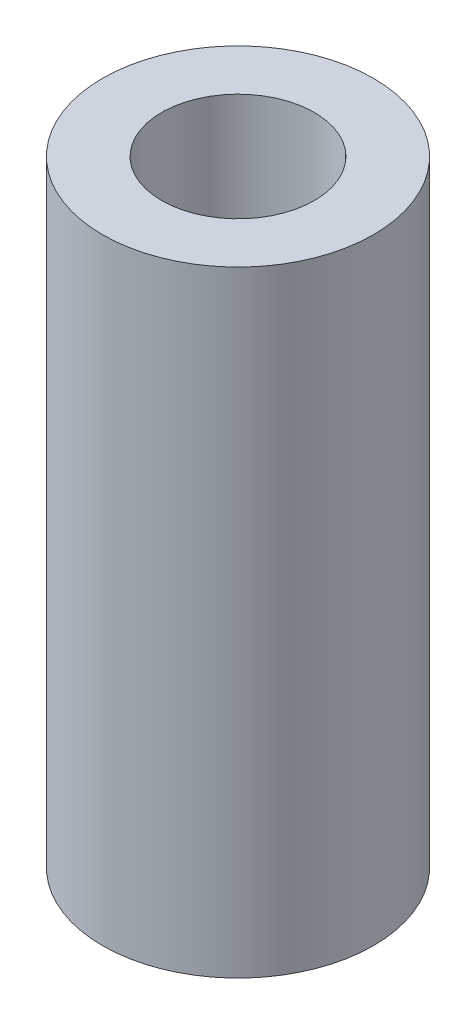
ISO-10303-21;
HEADER;
FILE_DESCRIPTION(('STEP AP214'),'2;1');
FILE_NAME('part.step','',(''),(''),'','','');
FILE_SCHEMA(('AUTOMOTIVE_DESIGN { 1 0 10303 214 1 1 1 1 }'));
ENDSEC;
DATA;
#1=APPLICATION_CONTEXT('core data for automotive mechanical design processes');
#2=APPLICATION_PROTOCOL_DEFINITION('international standard','automotive_design',2000,#1);
#3=PRODUCT_CONTEXT('',#1,'mechanical');
#4=PRODUCT('Part','Part','',(#3));
#5=PRODUCT_RELATED_PRODUCT_CATEGORY('part','',(#4));
#6=PRODUCT_DEFINITION_FORMATION('','',#4);
#7=PRODUCT_DEFINITION_CONTEXT('part definition',#1,'design');
#8=PRODUCT_DEFINITION('design','',#6,#7);
#9=PRODUCT_DEFINITION_SHAPE('','',#8);
#10=(LENGTH_UNIT() NAMED_UNIT(*) SI_UNIT(.MILLI.,.METRE.));
#11=(NAMED_UNIT(*) PLANE_ANGLE_UNIT() SI_UNIT($,.RADIAN.));
#12=(NAMED_UNIT(*) SI_UNIT($,.STERADIAN.) SOLID_ANGLE_UNIT());
#13=UNCERTAINTY_MEASURE_WITH_UNIT(LENGTH_MEASURE(1.E-05),#10,'distance_accuracy_value','');
#14=(GEOMETRIC_REPRESENTATION_CONTEXT(3) GLOBAL_UNCERTAINTY_ASSIGNED_CONTEXT((#13)) GLOBAL_UNIT_ASSIGNED_CONTEXT((#10,
#11,#12)) REPRESENTATION_CONTEXT('',''));
#15=CARTESIAN_POINT('',(0.,0.,0.));
#16=DIRECTION('',(0.,0.,1.));
#17=DIRECTION('',(1.,0.,0.));
#18=AXIS2_PLACEMENT_3D('',#15,#16,#17);
#19=CARTESIAN_POINT('',(0.,12.5,0.));
#20=DIRECTION('',(0.,1.,0.));
#21=DIRECTION('',(0.,0.,1.));
#22=AXIS2_PLACEMENT_3D('',#19,#20,#21);
#23=PLANE('',#22);
#24=CARTESIAN_POINT('',(0.,12.5,0.));
#25=DIRECTION('',(0.,1.,0.));
#26=DIRECTION('',(0.,0.,1.));
#27=AXIS2_PLACEMENT_3D('',#24,#25,#26);
#28=CIRCLE('',#27,2.75);
#29=CARTESIAN_POINT('',(0.,12.5,2.75));
#30=VERTEX_POINT('',#29);
#31=EDGE_CURVE('E10',#30,#30,#28,.T.);
#32=ORIENTED_EDGE('',*,*,#31,.T.);
#33=EDGE_LOOP('',(#32));
#34=FACE_BOUND('',#33,.T.);
#35=CARTESIAN_POINT('',(0.,12.5,0.));
#36=DIRECTION('',(0.,1.,0.));
#37=DIRECTION('',(0.,0.,1.));
#38=AXIS2_PLACEMENT_3D('',#35,#36,#37);
#39=CIRCLE('',#38,1.55);
#40=CARTESIAN_POINT('',(0.,12.5,1.55));
#41=VERTEX_POINT('',#40);
#42=EDGE_CURVE('E50',#41,#41,#39,.T.);
#43=ORIENTED_EDGE('',*,*,#42,.F.);
#44=EDGE_LOOP('',(#43));
#45=FACE_BOUND('',#44,.T.);
#46=ADVANCED_FACE('F37',(#34,#45),#23,.T.);
#47=CARTESIAN_POINT('',(0.,0.,0.));
#48=DIRECTION('',(0.,1.,0.));
#49=DIRECTION('',(0.,0.,1.));
#50=AXIS2_PLACEMENT_3D('',#47,#48,#49);
#51=PLANE('',#50);
#52=CARTESIAN_POINT('',(0.,0.,0.));
#53=DIRECTION('',(0.,1.,0.));
#54=DIRECTION('',(0.,0.,1.));
#55=AXIS2_PLACEMENT_3D('',#52,#53,#54);
#56=CIRCLE('',#55,2.75);
#57=CARTESIAN_POINT('',(0.,0.,2.75));
#58=VERTEX_POINT('',#57);
#59=EDGE_CURVE('E41',#58,#58,#56,.T.);
#60=ORIENTED_EDGE('',*,*,#59,.F.);
#61=EDGE_LOOP('',(#60));
#62=FACE_BOUND('',#61,.T.);
#63=CARTESIAN_POINT('',(0.,0.,0.));
#64=DIRECTION('',(0.,1.,0.));
#65=DIRECTION('',(0.,0.,1.));
#66=AXIS2_PLACEMENT_3D('',#63,#64,#65);
#67=CIRCLE('',#66,1.55);
#68=CARTESIAN_POINT('',(0.,0.,1.55));
#69=VERTEX_POINT('',#68);
#70=EDGE_CURVE('E52',#69,#69,#67,.T.);
#71=ORIENTED_EDGE('',*,*,#70,.T.);
#72=EDGE_LOOP('',(#71));
#73=FACE_BOUND('',#72,.T.);
#74=ADVANCED_FACE('F64',(#62,#73),#51,.F.);
#75=CARTESIAN_POINT('',(0.,12.5,0.));
#76=DIRECTION('',(0.,-1.,0.));
#77=DIRECTION('',(0.,0.,-1.));
#78=AXIS2_PLACEMENT_3D('',#75,#76,#77);
#79=CYLINDRICAL_SURFACE('',#78,2.75);
#80=ORIENTED_EDGE('',*,*,#31,.F.);
#81=EDGE_LOOP('',(#80));
#82=FACE_BOUND('',#81,.T.);
#83=ORIENTED_EDGE('',*,*,#59,.T.);
#84=EDGE_LOOP('',(#83));
#85=FACE_BOUND('',#84,.T.);
#86=ADVANCED_FACE('F39',(#82,#85),#79,.T.);
#87=CARTESIAN_POINT('',(0.,12.5,0.));
#88=DIRECTION('',(0.,-1.,0.));
#89=DIRECTION('',(0.,0.,-1.));
#90=AXIS2_PLACEMENT_3D('',#87,#88,#89);
#91=CYLINDRICAL_SURFACE('',#90,1.55);
#92=ORIENTED_EDGE('',*,*,#42,.T.);
#93=EDGE_LOOP('',(#92));
#94=FACE_BOUND('',#93,.T.);
#95=ORIENTED_EDGE('',*,*,#70,.F.);
#96=EDGE_LOOP('',(#95));
#97=FACE_BOUND('',#96,.T.);
#98=ADVANCED_FACE('F60',(#94,#97),#91,.F.);
#99=CLOSED_SHELL('',(#46,#74,#86,#98));
#100=MANIFOLD_SOLID_BREP('B2',#99);
#101=ADVANCED_BREP_SHAPE_REPRESENTATION('',(#18,#100),#14);
#102=SHAPE_DEFINITION_REPRESENTATION(#9,#101);
ENDSEC;
END-ISO-10303-21;
